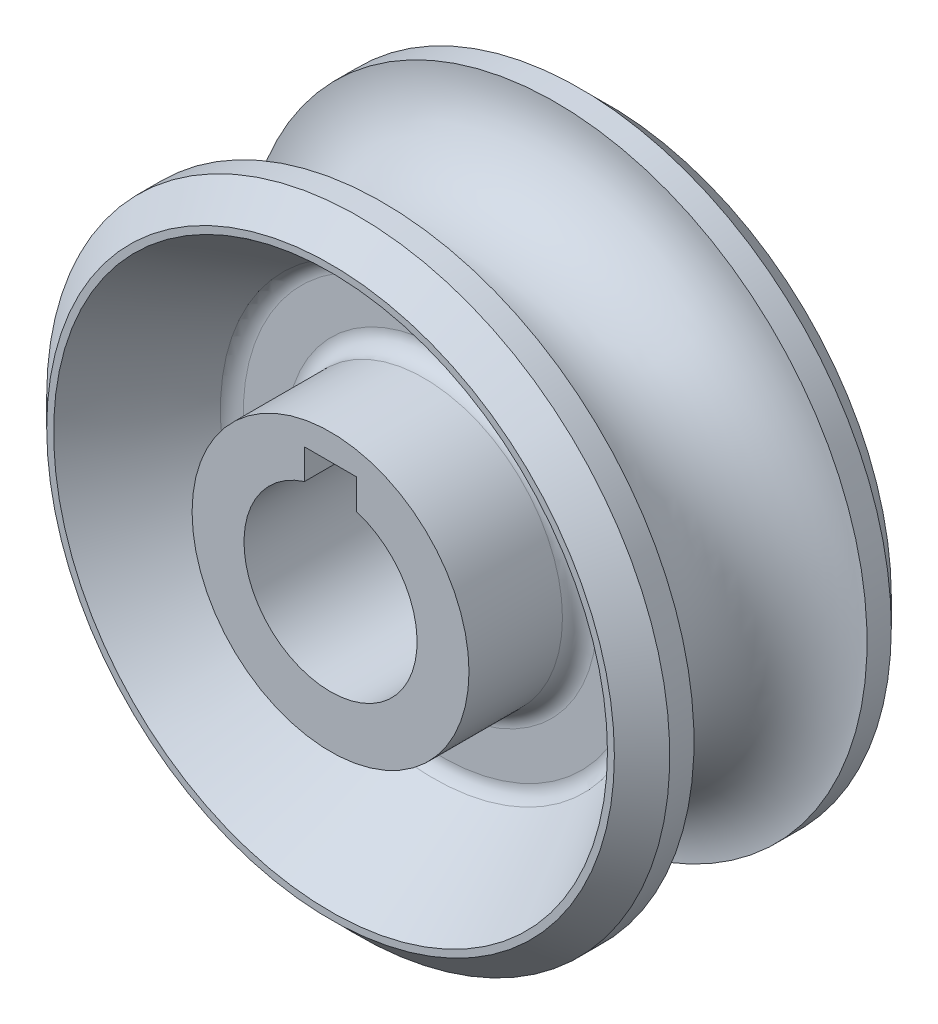
ISO-10303-21;
HEADER;
FILE_DESCRIPTION(('STEP AP214'),'2;1');
FILE_NAME('part.step','',(''),(''),'','','');
FILE_SCHEMA(('AUTOMOTIVE_DESIGN { 1 0 10303 214 1 1 1 1 }'));
ENDSEC;
DATA;
#1=APPLICATION_CONTEXT('core data for automotive mechanical design processes');
#2=APPLICATION_PROTOCOL_DEFINITION('international standard','automotive_design',2000,#1);
#3=PRODUCT_CONTEXT('',#1,'mechanical');
#4=PRODUCT('Part','Part','',(#3));
#5=PRODUCT_RELATED_PRODUCT_CATEGORY('part','',(#4));
#6=PRODUCT_DEFINITION_FORMATION('','',#4);
#7=PRODUCT_DEFINITION_CONTEXT('part definition',#1,'design');
#8=PRODUCT_DEFINITION('design','',#6,#7);
#9=PRODUCT_DEFINITION_SHAPE('','',#8);
#10=(LENGTH_UNIT() NAMED_UNIT(*) SI_UNIT(.MILLI.,.METRE.));
#11=(NAMED_UNIT(*) PLANE_ANGLE_UNIT() SI_UNIT($,.RADIAN.));
#12=(NAMED_UNIT(*) SI_UNIT($,.STERADIAN.) SOLID_ANGLE_UNIT());
#13=UNCERTAINTY_MEASURE_WITH_UNIT(LENGTH_MEASURE(1.E-05),#10,'distance_accuracy_value','');
#14=(GEOMETRIC_REPRESENTATION_CONTEXT(3) GLOBAL_UNCERTAINTY_ASSIGNED_CONTEXT((#13)) GLOBAL_UNIT_ASSIGNED_CONTEXT((#10,
#11,#12)) REPRESENTATION_CONTEXT('',''));
#15=CARTESIAN_POINT('',(0.,0.,0.));
#16=DIRECTION('',(0.,0.,1.));
#17=DIRECTION('',(1.,0.,0.));
#18=AXIS2_PLACEMENT_3D('',#15,#16,#17);
#19=CARTESIAN_POINT('',(0.,0.,12.7));
#20=DIRECTION('',(0.,0.,1.));
#21=DIRECTION('',(1.,0.,0.));
#22=AXIS2_PLACEMENT_3D('',#19,#20,#21);
#23=PLANE('',#22);
#24=DIRECTION('',(0.,-1.,0.));
#25=VECTOR('',#24,1.);
#26=CARTESIAN_POINT('',(-2.3876,10.3251,12.7));
#27=LINE('',#26,#25);
#28=CARTESIAN_POINT('',(-2.3876,10.3251,12.7));
#29=VERTEX_POINT('',#28);
#30=CARTESIAN_POINT('',(-2.3876,7.56989250187874,12.7));
#31=VERTEX_POINT('',#30);
#32=EDGE_CURVE('E82',#29,#31,#27,.T.);
#33=ORIENTED_EDGE('',*,*,#32,.F.);
#34=DIRECTION('',(-1.,0.,0.));
#35=VECTOR('',#34,1.);
#36=CARTESIAN_POINT('',(-2.3876,10.3251,12.7));
#37=LINE('',#36,#35);
#38=CARTESIAN_POINT('',(2.3876,10.3251,12.7));
#39=VERTEX_POINT('',#38);
#40=EDGE_CURVE('E81',#39,#29,#37,.T.);
#41=ORIENTED_EDGE('',*,*,#40,.F.);
#42=DIRECTION('',(0.,1.,0.));
#43=VECTOR('',#42,1.);
#44=CARTESIAN_POINT('',(2.3876,10.3251,12.7));
#45=LINE('',#44,#43);
#46=CARTESIAN_POINT('',(2.3876,7.56989250187874,12.7));
#47=VERTEX_POINT('',#46);
#48=EDGE_CURVE('E72',#47,#39,#45,.T.);
#49=ORIENTED_EDGE('',*,*,#48,.F.);
#50=CARTESIAN_POINT('',(0.,0.,12.7));
#51=DIRECTION('',(0.,0.,1.));
#52=DIRECTION('',(1.,0.,0.));
#53=AXIS2_PLACEMENT_3D('',#50,#51,#52);
#54=CIRCLE('',#53,7.9375);
#55=EDGE_CURVE('E114',#31,#47,#54,.T.);
#56=ORIENTED_EDGE('',*,*,#55,.F.);
#57=EDGE_LOOP('',(#33,#41,#49,#56));
#58=FACE_BOUND('',#57,.T.);
#59=CARTESIAN_POINT('',(0.,0.,12.7));
#60=DIRECTION('',(0.,0.,1.));
#61=DIRECTION('',(1.,0.,0.));
#62=AXIS2_PLACEMENT_3D('',#59,#60,#61);
#63=CIRCLE('',#62,12.7);
#64=CARTESIAN_POINT('',(12.7,0.,12.7));
#65=VERTEX_POINT('',#64);
#66=EDGE_CURVE('E100',#65,#65,#63,.T.);
#67=ORIENTED_EDGE('',*,*,#66,.T.);
#68=EDGE_LOOP('',(#67));
#69=FACE_BOUND('',#68,.T.);
#70=ADVANCED_FACE('F34',(#58,#69),#23,.T.);
#71=CARTESIAN_POINT('',(0.,0.,-12.7));
#72=DIRECTION('',(0.,0.,1.));
#73=DIRECTION('',(1.,0.,0.));
#74=AXIS2_PLACEMENT_3D('',#71,#72,#73);
#75=PLANE('',#74);
#76=CARTESIAN_POINT('',(0.,0.,-12.7));
#77=DIRECTION('',(0.,0.,1.));
#78=DIRECTION('',(1.,0.,0.));
#79=AXIS2_PLACEMENT_3D('',#76,#77,#78);
#80=CIRCLE('',#79,26.0349999999999);
#81=CARTESIAN_POINT('',(26.0349999999999,0.,-12.7));
#82=VERTEX_POINT('',#81);
#83=EDGE_CURVE('E127',#82,#82,#80,.F.);
#84=ORIENTED_EDGE('',*,*,#83,.T.);
#85=EDGE_LOOP('',(#84));
#86=FACE_BOUND('',#85,.T.);
#87=CARTESIAN_POINT('',(0.,0.,-12.7));
#88=DIRECTION('',(0.,0.,1.));
#89=DIRECTION('',(1.,0.,0.));
#90=AXIS2_PLACEMENT_3D('',#87,#88,#89);
#91=CIRCLE('',#90,25.4);
#92=CARTESIAN_POINT('',(25.4,0.,-12.7));
#93=VERTEX_POINT('',#92);
#94=EDGE_CURVE('E110',#93,#93,#91,.T.);
#95=ORIENTED_EDGE('',*,*,#94,.T.);
#96=EDGE_LOOP('',(#95));
#97=FACE_BOUND('',#96,.T.);
#98=ADVANCED_FACE('F185',(#86,#97),#75,.F.);
#99=DIRECTION('',(-1.,0.,0.));
#100=VECTOR('',#99,1.);
#101=CARTESIAN_POINT('',(-2.3876,10.3251,-12.7));
#102=LINE('',#101,#100);
#103=CARTESIAN_POINT('',(2.3876,10.3251,-12.7));
#104=VERTEX_POINT('',#103);
#105=CARTESIAN_POINT('',(-2.3876,10.3251,-12.7));
#106=VERTEX_POINT('',#105);
#107=EDGE_CURVE('E89',#104,#106,#102,.T.);
#108=ORIENTED_EDGE('',*,*,#107,.T.);
#109=DIRECTION('',(0.,-1.,0.));
#110=VECTOR('',#109,1.);
#111=CARTESIAN_POINT('',(-2.3876,10.3251,-12.7));
#112=LINE('',#111,#110);
#113=CARTESIAN_POINT('',(-2.3876,7.56989250187874,-12.7));
#114=VERTEX_POINT('',#113);
#115=EDGE_CURVE('E93',#106,#114,#112,.T.);
#116=ORIENTED_EDGE('',*,*,#115,.T.);
#117=CARTESIAN_POINT('',(0.,0.,-12.7));
#118=DIRECTION('',(0.,0.,1.));
#119=DIRECTION('',(1.,0.,0.));
#120=AXIS2_PLACEMENT_3D('',#117,#118,#119);
#121=CIRCLE('',#120,7.9375);
#122=CARTESIAN_POINT('',(2.3876,7.56989250187874,-12.7));
#123=VERTEX_POINT('',#122);
#124=EDGE_CURVE('E117',#114,#123,#121,.T.);
#125=ORIENTED_EDGE('',*,*,#124,.T.);
#126=DIRECTION('',(0.,1.,0.));
#127=VECTOR('',#126,1.);
#128=CARTESIAN_POINT('',(2.3876,10.3251,-12.7));
#129=LINE('',#128,#127);
#130=EDGE_CURVE('E49',#123,#104,#129,.T.);
#131=ORIENTED_EDGE('',*,*,#130,.T.);
#132=EDGE_LOOP('',(#108,#116,#125,#131));
#133=FACE_BOUND('',#132,.T.);
#134=CARTESIAN_POINT('',(0.,0.,-12.7));
#135=DIRECTION('',(0.,0.,1.));
#136=DIRECTION('',(1.,0.,0.));
#137=AXIS2_PLACEMENT_3D('',#134,#135,#136);
#138=CIRCLE('',#137,12.7);
#139=CARTESIAN_POINT('',(12.7,0.,-12.7));
#140=VERTEX_POINT('',#139);
#141=EDGE_CURVE('E107',#140,#140,#138,.T.);
#142=ORIENTED_EDGE('',*,*,#141,.F.);
#143=EDGE_LOOP('',(#142));
#144=FACE_BOUND('',#143,.T.);
#145=ADVANCED_FACE('F191',(#133,#144),#75,.F.);
#146=CARTESIAN_POINT('',(0.,0.,12.7));
#147=DIRECTION('',(0.,0.,-1.));
#148=DIRECTION('',(-1.,0.,0.));
#149=AXIS2_PLACEMENT_3D('',#146,#147,#148);
#150=CYLINDRICAL_SURFACE('',#149,28.575);
#151=CARTESIAN_POINT('',(0.,0.,10.16));
#152=DIRECTION('',(0.,0.,1.));
#153=DIRECTION('',(1.,0.,0.));
#154=AXIS2_PLACEMENT_3D('',#151,#152,#153);
#155=CIRCLE('',#154,28.575);
#156=CARTESIAN_POINT('',(-28.575,0.,10.16));
#157=VERTEX_POINT('',#156);
#158=EDGE_CURVE('E133',#157,#157,#155,.F.);
#159=CARTESIAN_POINT('',(0.,0.,7.9375));
#160=DIRECTION('',(0.,0.,-1.));
#161=DIRECTION('',(-1.,0.,0.));
#162=AXIS2_PLACEMENT_3D('',#159,#160,#161);
#163=CIRCLE('',#162,28.575);
#164=CARTESIAN_POINT('',(-28.575,0.,7.9375));
#165=VERTEX_POINT('',#164);
#166=EDGE_CURVE('E120',#165,#165,#163,.T.);
#167=CARTESIAN_POINT('',(-28.575,0.,10.16));
#168=CARTESIAN_POINT('',(-28.575,0.,10.1368489583333));
#169=CARTESIAN_POINT('',(-28.575,0.,10.1136979166667));
#170=CARTESIAN_POINT('',(-28.575,0.,10.0673958333333));
#171=CARTESIAN_POINT('',(-28.575,0.,10.0442447916667));
#172=CARTESIAN_POINT('',(-28.575,0.,9.99794270833335));
#173=CARTESIAN_POINT('',(-28.575,0.,9.97479166666668));
#174=CARTESIAN_POINT('',(-28.575,0.,9.92848958333335));
#175=CARTESIAN_POINT('',(-28.575,0.,9.90533854166668));
#176=CARTESIAN_POINT('',(-28.575,0.,9.85903645833334));
#177=CARTESIAN_POINT('',(-28.575,0.,9.83588541666668));
#178=CARTESIAN_POINT('',(-28.575,0.,9.78958333333335));
#179=CARTESIAN_POINT('',(-28.575,0.,9.76643229166668));
#180=CARTESIAN_POINT('',(-28.575,0.,9.72013020833334));
#181=CARTESIAN_POINT('',(-28.575,0.,9.69697916666668));
#182=CARTESIAN_POINT('',(-28.575,0.,9.65067708333334));
#183=CARTESIAN_POINT('',(-28.575,0.,9.62752604166668));
#184=CARTESIAN_POINT('',(-28.575,0.,9.58122395833334));
#185=CARTESIAN_POINT('',(-28.575,0.,9.55807291666668));
#186=CARTESIAN_POINT('',(-28.575,0.,9.51177083333334));
#187=CARTESIAN_POINT('',(-28.575,0.,9.48861979166668));
#188=CARTESIAN_POINT('',(-28.575,0.,9.44231770833334));
#189=CARTESIAN_POINT('',(-28.575,0.,9.41916666666667));
#190=CARTESIAN_POINT('',(-28.575,0.,9.37286458333334));
#191=CARTESIAN_POINT('',(-28.575,0.,9.34971354166667));
#192=CARTESIAN_POINT('',(-28.575,0.,9.30341145833334));
#193=CARTESIAN_POINT('',(-28.575,0.,9.28026041666667));
#194=CARTESIAN_POINT('',(-28.575,0.,9.23395833333334));
#195=CARTESIAN_POINT('',(-28.575,0.,9.21080729166667));
#196=CARTESIAN_POINT('',(-28.575,0.,9.16450520833334));
#197=CARTESIAN_POINT('',(-28.575,0.,9.14135416666667));
#198=CARTESIAN_POINT('',(-28.575,0.,9.09505208333334));
#199=CARTESIAN_POINT('',(-28.575,0.,9.07190104166667));
#200=CARTESIAN_POINT('',(-28.575,0.,9.02559895833334));
#201=CARTESIAN_POINT('',(-28.575,0.,9.00244791666667));
#202=CARTESIAN_POINT('',(-28.575,0.,8.95614583333334));
#203=CARTESIAN_POINT('',(-28.575,0.,8.93299479166667));
#204=CARTESIAN_POINT('',(-28.575,0.,8.88669270833334));
#205=CARTESIAN_POINT('',(-28.575,0.,8.86354166666667));
#206=CARTESIAN_POINT('',(-28.575,0.,8.81723958333334));
#207=CARTESIAN_POINT('',(-28.575,0.,8.79408854166667));
#208=CARTESIAN_POINT('',(-28.575,0.,8.74778645833334));
#209=CARTESIAN_POINT('',(-28.575,0.,8.72463541666667));
#210=CARTESIAN_POINT('',(-28.575,0.,8.67833333333333));
#211=CARTESIAN_POINT('',(-28.575,0.,8.65518229166667));
#212=CARTESIAN_POINT('',(-28.575,0.,8.60888020833333));
#213=CARTESIAN_POINT('',(-28.575,0.,8.58572916666667));
#214=CARTESIAN_POINT('',(-28.575,0.,8.53942708333333));
#215=CARTESIAN_POINT('',(-28.575,0.,8.51627604166667));
#216=CARTESIAN_POINT('',(-28.575,0.,8.46997395833333));
#217=CARTESIAN_POINT('',(-28.575,0.,8.44682291666667));
#218=CARTESIAN_POINT('',(-28.575,0.,8.40052083333333));
#219=CARTESIAN_POINT('',(-28.575,0.,8.37736979166667));
#220=CARTESIAN_POINT('',(-28.575,0.,8.33106770833333));
#221=CARTESIAN_POINT('',(-28.575,0.,8.30791666666667));
#222=CARTESIAN_POINT('',(-28.575,0.,8.26161458333333));
#223=CARTESIAN_POINT('',(-28.575,0.,8.23846354166667));
#224=CARTESIAN_POINT('',(-28.575,0.,8.19216145833333));
#225=CARTESIAN_POINT('',(-28.575,0.,8.16901041666667));
#226=CARTESIAN_POINT('',(-28.575,0.,8.12270833333333));
#227=CARTESIAN_POINT('',(-28.575,0.,8.09955729166666));
#228=CARTESIAN_POINT('',(-28.575,0.,8.05325520833333));
#229=CARTESIAN_POINT('',(-28.575,0.,8.03010416666666));
#230=CARTESIAN_POINT('',(-28.575,0.,7.98380208333333));
#231=CARTESIAN_POINT('',(-28.575,0.,7.96065104166666));
#232=CARTESIAN_POINT('',(-28.575,0.,7.9375));
#233=B_SPLINE_CURVE_WITH_KNOTS('',3,(#167,#168,#169,#170,#171,#172,#173,#174,#175,#176,#177,
#178,#179,#180,#181,#182,#183,#184,#185,#186,#187,#188,#189,#190,#191,#192,#193,#194,#195,#196,
#197,#198,#199,#200,#201,#202,#203,#204,#205,#206,#207,#208,#209,#210,#211,#212,#213,#214,#215,
#216,#217,#218,#219,#220,#221,#222,#223,#224,#225,#226,#227,#228,#229,#230,#231,#232),
.UNSPECIFIED.,.F.,.F.,(4,2,2,2,2,2,2,2,2,2,2,2,2,2,2,2,2,2,2,2,2,2,2,2,2,2,2,2,2,2,2,2,4),(0.,
0.0694531250000005,0.138906250000001,0.208359375000002,0.277812500000002,0.347265625000003,
0.416718750000003,0.486171875000004,0.555625000000004,0.625078125000005,0.694531250000005,
0.763984375000007,0.833437500000008,0.902890625000008,0.972343750000009,1.04179687500001,
1.11125000000001,1.18070312500001,1.25015625000001,1.31960937500001,1.38906250000001,
1.45851562500001,1.52796875000001,1.59742187500001,1.66687500000001,1.73632812500001,
1.80578125000001,1.87523437500002,1.94468750000002,2.01414062500002,2.08359375000002,
2.15304687500002,2.22250000000002),.UNSPECIFIED.);
#234=EDGE_CURVE('BSEAM205',#157,#165,#233,.T.);
#235=ORIENTED_EDGE('',*,*,#158,.T.);
#236=ORIENTED_EDGE('',*,*,#166,.F.);
#237=ORIENTED_EDGE('',*,*,#234,.T.);
#238=ORIENTED_EDGE('',*,*,#234,.F.);
#239=EDGE_LOOP('',(#235,#237,#236,#238));
#240=FACE_BOUND('',#239,.T.);
#241=ADVANCED_FACE('F205',(#240),#150,.T.);
#242=CARTESIAN_POINT('',(0.,0.,-10.1599999999999));
#243=DIRECTION('',(0.,0.,1.));
#244=DIRECTION('',(1.,0.,0.));
#245=AXIS2_PLACEMENT_3D('',#242,#243,#244);
#246=CIRCLE('',#245,28.575);
#247=CARTESIAN_POINT('',(-28.575,0.,-10.16));
#248=VERTEX_POINT('',#247);
#249=EDGE_CURVE('E116',#248,#248,#246,.T.);
#250=CARTESIAN_POINT('',(0.,0.,-7.9375));
#251=DIRECTION('',(0.,0.,1.));
#252=DIRECTION('',(1.,0.,0.));
#253=AXIS2_PLACEMENT_3D('',#250,#251,#252);
#254=CIRCLE('',#253,28.575);
#255=CARTESIAN_POINT('',(-28.575,0.,-7.93750000000001));
#256=VERTEX_POINT('',#255);
#257=EDGE_CURVE('E113',#256,#256,#254,.T.);
#258=CARTESIAN_POINT('',(-28.575,0.,-10.16));
#259=CARTESIAN_POINT('',(-28.575,0.,-10.1368489583333));
#260=CARTESIAN_POINT('',(-28.575,0.,-10.1136979166666));
#261=CARTESIAN_POINT('',(-28.575,0.,-10.0673958333333));
#262=CARTESIAN_POINT('',(-28.575,0.,-10.0442447916666));
#263=CARTESIAN_POINT('',(-28.575,0.,-9.99794270833329));
#264=CARTESIAN_POINT('',(-28.575,0.,-9.97479166666662));
#265=CARTESIAN_POINT('',(-28.575,0.,-9.92848958333329));
#266=CARTESIAN_POINT('',(-28.575,0.,-9.90533854166662));
#267=CARTESIAN_POINT('',(-28.575,0.,-9.85903645833329));
#268=CARTESIAN_POINT('',(-28.575,0.,-9.83588541666663));
#269=CARTESIAN_POINT('',(-28.575,0.,-9.78958333333329));
#270=CARTESIAN_POINT('',(-28.575,0.,-9.76643229166663));
#271=CARTESIAN_POINT('',(-28.575,0.,-9.72013020833329));
#272=CARTESIAN_POINT('',(-28.575,0.,-9.69697916666663));
#273=CARTESIAN_POINT('',(-28.575,0.,-9.6506770833333));
#274=CARTESIAN_POINT('',(-28.575,0.,-9.62752604166663));
#275=CARTESIAN_POINT('',(-28.575,0.,-9.5812239583333));
#276=CARTESIAN_POINT('',(-28.575,0.,-9.55807291666663));
#277=CARTESIAN_POINT('',(-28.575,0.,-9.5117708333333));
#278=CARTESIAN_POINT('',(-28.575,0.,-9.48861979166663));
#279=CARTESIAN_POINT('',(-28.575,0.,-9.4423177083333));
#280=CARTESIAN_POINT('',(-28.575,0.,-9.41916666666664));
#281=CARTESIAN_POINT('',(-28.575,0.,-9.37286458333331));
#282=CARTESIAN_POINT('',(-28.575,0.,-9.34971354166664));
#283=CARTESIAN_POINT('',(-28.575,0.,-9.30341145833331));
#284=CARTESIAN_POINT('',(-28.575,0.,-9.28026041666664));
#285=CARTESIAN_POINT('',(-28.575,0.,-9.23395833333331));
#286=CARTESIAN_POINT('',(-28.575,0.,-9.21080729166664));
#287=CARTESIAN_POINT('',(-28.575,0.,-9.16450520833331));
#288=CARTESIAN_POINT('',(-28.575,0.,-9.14135416666664));
#289=CARTESIAN_POINT('',(-28.575,0.,-9.09505208333331));
#290=CARTESIAN_POINT('',(-28.575,0.,-9.07190104166664));
#291=CARTESIAN_POINT('',(-28.575,0.,-9.02559895833331));
#292=CARTESIAN_POINT('',(-28.575,0.,-9.00244791666665));
#293=CARTESIAN_POINT('',(-28.575,0.,-8.95614583333331));
#294=CARTESIAN_POINT('',(-28.575,0.,-8.93299479166665));
#295=CARTESIAN_POINT('',(-28.575,0.,-8.88669270833332));
#296=CARTESIAN_POINT('',(-28.575,0.,-8.86354166666665));
#297=CARTESIAN_POINT('',(-28.575,0.,-8.81723958333332));
#298=CARTESIAN_POINT('',(-28.575,0.,-8.79408854166665));
#299=CARTESIAN_POINT('',(-28.575,0.,-8.74778645833332));
#300=CARTESIAN_POINT('',(-28.575,0.,-8.72463541666665));
#301=CARTESIAN_POINT('',(-28.575,0.,-8.67833333333332));
#302=CARTESIAN_POINT('',(-28.575,0.,-8.65518229166666));
#303=CARTESIAN_POINT('',(-28.575,0.,-8.60888020833332));
#304=CARTESIAN_POINT('',(-28.575,0.,-8.58572916666666));
#305=CARTESIAN_POINT('',(-28.575,0.,-8.53942708333332));
#306=CARTESIAN_POINT('',(-28.575,0.,-8.51627604166666));
#307=CARTESIAN_POINT('',(-28.575,0.,-8.46997395833333));
#308=CARTESIAN_POINT('',(-28.575,0.,-8.44682291666666));
#309=CARTESIAN_POINT('',(-28.575,0.,-8.40052083333333));
#310=CARTESIAN_POINT('',(-28.575,0.,-8.37736979166666));
#311=CARTESIAN_POINT('',(-28.575,0.,-8.33106770833333));
#312=CARTESIAN_POINT('',(-28.575,0.,-8.30791666666666));
#313=CARTESIAN_POINT('',(-28.575,0.,-8.26161458333333));
#314=CARTESIAN_POINT('',(-28.575,0.,-8.23846354166667));
#315=CARTESIAN_POINT('',(-28.575,0.,-8.19216145833333));
#316=CARTESIAN_POINT('',(-28.575,0.,-8.16901041666667));
#317=CARTESIAN_POINT('',(-28.575,0.,-8.12270833333333));
#318=CARTESIAN_POINT('',(-28.575,0.,-8.09955729166667));
#319=CARTESIAN_POINT('',(-28.575,0.,-8.05325520833333));
#320=CARTESIAN_POINT('',(-28.575,0.,-8.03010416666667));
#321=CARTESIAN_POINT('',(-28.575,0.,-7.98380208333334));
#322=CARTESIAN_POINT('',(-28.575,0.,-7.96065104166667));
#323=CARTESIAN_POINT('',(-28.575,0.,-7.93750000000001));
#324=B_SPLINE_CURVE_WITH_KNOTS('',3,(#258,#259,#260,#261,#262,#263,#264,#265,#266,#267,#268,
#269,#270,#271,#272,#273,#274,#275,#276,#277,#278,#279,#280,#281,#282,#283,#284,#285,#286,#287,
#288,#289,#290,#291,#292,#293,#294,#295,#296,#297,#298,#299,#300,#301,#302,#303,#304,#305,#306,
#307,#308,#309,#310,#311,#312,#313,#314,#315,#316,#317,#318,#319,#320,#321,#322,#323),
.UNSPECIFIED.,.F.,.F.,(4,2,2,2,2,2,2,2,2,2,2,2,2,2,2,2,2,2,2,2,2,2,2,2,2,2,2,2,2,2,2,2,4),(0.,
0.069453124999997,0.138906249999998,0.208359374999995,0.277812499999995,0.347265624999992,
0.416718749999989,0.48617187499999,0.555624999999987,0.625078124999984,0.694531249999984,
0.763984374999981,0.833437499999978,0.902890624999979,0.972343749999976,1.04179687499998,
1.11124999999997,1.18070312499997,1.25015624999997,1.31960937499997,1.38906249999997,
1.45851562499997,1.52796874999996,1.59742187499996,1.66687499999996,1.73632812499996,
1.80578124999996,1.87523437499995,1.94468749999995,2.01414062499995,2.08359374999995,
2.15304687499995,2.22249999999995),.UNSPECIFIED.);
#325=EDGE_CURVE('BSEAM197',#248,#256,#324,.T.);
#326=ORIENTED_EDGE('',*,*,#249,.T.);
#327=ORIENTED_EDGE('',*,*,#257,.F.);
#328=ORIENTED_EDGE('',*,*,#325,.T.);
#329=ORIENTED_EDGE('',*,*,#325,.F.);
#330=EDGE_LOOP('',(#326,#328,#327,#329));
#331=FACE_BOUND('',#330,.T.);
#332=ADVANCED_FACE('F197',(#331),#150,.T.);
#333=CARTESIAN_POINT('',(0.,0.,12.7));
#334=DIRECTION('',(0.,0.,1.));
#335=DIRECTION('',(1.,0.,0.));
#336=AXIS2_PLACEMENT_3D('',#333,#334,#335);
#337=CIRCLE('',#336,26.035);
#338=CARTESIAN_POINT('',(26.035,0.,12.7));
#339=VERTEX_POINT('',#338);
#340=EDGE_CURVE('E130',#339,#339,#337,.T.);
#341=ORIENTED_EDGE('',*,*,#340,.T.);
#342=EDGE_LOOP('',(#341));
#343=FACE_BOUND('',#342,.T.);
#344=CARTESIAN_POINT('',(0.,0.,12.7));
#345=DIRECTION('',(0.,0.,1.));
#346=DIRECTION('',(1.,0.,0.));
#347=AXIS2_PLACEMENT_3D('',#344,#345,#346);
#348=CIRCLE('',#347,25.4);
#349=CARTESIAN_POINT('',(25.4,0.,12.7));
#350=VERTEX_POINT('',#349);
#351=EDGE_CURVE('E104',#350,#350,#348,.T.);
#352=ORIENTED_EDGE('',*,*,#351,.F.);
#353=EDGE_LOOP('',(#352));
#354=FACE_BOUND('',#353,.T.);
#355=ADVANCED_FACE('F187',(#343,#354),#23,.T.);
#356=CARTESIAN_POINT('',(0.,0.,12.7));
#357=DIRECTION('',(0.,0.,-1.));
#358=DIRECTION('',(-1.,0.,0.));
#359=AXIS2_PLACEMENT_3D('',#356,#357,#358);
#360=CYLINDRICAL_SURFACE('',#359,7.9375);
#361=DIRECTION('',(0.,0.,-1.));
#362=VECTOR('',#361,1.);
#363=CARTESIAN_POINT('',(-2.3876,7.56989250187874,12.7));
#364=LINE('',#363,#362);
#365=EDGE_CURVE('E11',#31,#114,#364,.T.);
#366=ORIENTED_EDGE('',*,*,#365,.F.);
#367=ORIENTED_EDGE('',*,*,#55,.T.);
#368=DIRECTION('',(0.,0.,-1.));
#369=VECTOR('',#368,1.);
#370=CARTESIAN_POINT('',(2.3876,7.56989250187874,12.7));
#371=LINE('',#370,#369);
#372=EDGE_CURVE('E42',#123,#47,#371,.F.);
#373=ORIENTED_EDGE('',*,*,#372,.F.);
#374=ORIENTED_EDGE('',*,*,#124,.F.);
#375=EDGE_LOOP('',(#366,#367,#373,#374));
#376=FACE_BOUND('',#375,.T.);
#377=ADVANCED_FACE('F196',(#376),#360,.F.);
#378=CARTESIAN_POINT('',(0.,0.,0.));
#379=DIRECTION('',(0.,0.,1.));
#380=DIRECTION('',(1.,0.,0.));
#381=AXIS2_PLACEMENT_3D('',#378,#379,#380);
#382=TOROIDAL_SURFACE('',#381,28.575,7.9375);
#383=ORIENTED_EDGE('',*,*,#257,.T.);
#384=EDGE_LOOP('',(#383));
#385=FACE_BOUND('',#384,.T.);
#386=ORIENTED_EDGE('',*,*,#166,.T.);
#387=EDGE_LOOP('',(#386));
#388=FACE_BOUND('',#387,.T.);
#389=ADVANCED_FACE('F203',(#385,#388),#382,.F.);
#390=CARTESIAN_POINT('',(0.,0.,-12.7));
#391=DIRECTION('',(0.,0.,-1.));
#392=DIRECTION('',(-1.,0.,0.));
#393=AXIS2_PLACEMENT_3D('',#390,#391,#392);
#394=CONICAL_SURFACE('',#393,25.4,0.558599315343563);
#395=CARTESIAN_POINT('',(0.,0.,-3.28612668274496));
#396=DIRECTION('',(0.,0.,-1.));
#397=DIRECTION('',(-1.,0.,0.));
#398=AXIS2_PLACEMENT_3D('',#395,#396,#397);
#399=CIRCLE('',#398,19.5163291767156);
#400=CARTESIAN_POINT('',(-19.5163291767156,0.,-3.28612668274496));
#401=VERTEX_POINT('',#400);
#402=EDGE_CURVE('E136',#401,#401,#399,.F.);
#403=ORIENTED_EDGE('',*,*,#402,.T.);
#404=EDGE_LOOP('',(#403));
#405=FACE_BOUND('',#404,.T.);
#406=ORIENTED_EDGE('',*,*,#94,.F.);
#407=EDGE_LOOP('',(#406));
#408=FACE_BOUND('',#407,.T.);
#409=ADVANCED_FACE('F324',(#405,#408),#394,.F.);
#410=CARTESIAN_POINT('',(0.,0.,0.));
#411=DIRECTION('',(0.,0.,1.));
#412=DIRECTION('',(1.,0.,0.));
#413=AXIS2_PLACEMENT_3D('',#410,#411,#412);
#414=CYLINDRICAL_SURFACE('',#413,12.7);
#415=CARTESIAN_POINT('',(0.,0.,-4.1275));
#416=DIRECTION('',(0.,0.,-1.));
#417=DIRECTION('',(-1.,0.,0.));
#418=AXIS2_PLACEMENT_3D('',#415,#416,#417);
#419=CIRCLE('',#418,12.7);
#420=CARTESIAN_POINT('',(-12.7,0.,-4.1275));
#421=VERTEX_POINT('',#420);
#422=EDGE_CURVE('E145',#421,#421,#419,.T.);
#423=ORIENTED_EDGE('',*,*,#422,.T.);
#424=EDGE_LOOP('',(#423));
#425=FACE_BOUND('',#424,.T.);
#426=ORIENTED_EDGE('',*,*,#141,.T.);
#427=EDGE_LOOP('',(#426));
#428=FACE_BOUND('',#427,.T.);
#429=ADVANCED_FACE('F315',(#425,#428),#414,.T.);
#430=CARTESIAN_POINT('',(0.,12.7,-2.54));
#431=DIRECTION('',(0.,0.,-1.));
#432=DIRECTION('',(-1.,0.,0.));
#433=AXIS2_PLACEMENT_3D('',#430,#431,#432);
#434=PLANE('',#433);
#435=CARTESIAN_POINT('',(0.,0.,-2.54));
#436=DIRECTION('',(0.,0.,-1.));
#437=DIRECTION('',(-1.,0.,0.));
#438=AXIS2_PLACEMENT_3D('',#435,#436,#437);
#439=CIRCLE('',#438,18.1701318691075);
#440=CARTESIAN_POINT('',(-18.1701318691075,0.,-2.54));
#441=VERTEX_POINT('',#440);
#442=EDGE_CURVE('E142',#441,#441,#439,.T.);
#443=ORIENTED_EDGE('',*,*,#442,.T.);
#444=EDGE_LOOP('',(#443));
#445=FACE_BOUND('',#444,.T.);
#446=CARTESIAN_POINT('',(0.,0.,-2.54));
#447=DIRECTION('',(0.,0.,-1.));
#448=DIRECTION('',(-1.,0.,0.));
#449=AXIS2_PLACEMENT_3D('',#446,#447,#448);
#450=CIRCLE('',#449,14.2875);
#451=CARTESIAN_POINT('',(-14.2875,0.,-2.54));
#452=VERTEX_POINT('',#451);
#453=EDGE_CURVE('E139',#452,#452,#450,.F.);
#454=ORIENTED_EDGE('',*,*,#453,.T.);
#455=EDGE_LOOP('',(#454));
#456=FACE_BOUND('',#455,.T.);
#457=ADVANCED_FACE('F181',(#445,#456),#434,.T.);
#458=CARTESIAN_POINT('',(0.,0.,0.));
#459=DIRECTION('',(0.,0.,1.));
#460=DIRECTION('',(1.,0.,0.));
#461=AXIS2_PLACEMENT_3D('',#458,#459,#460);
#462=CYLINDRICAL_SURFACE('',#461,12.7);
#463=CARTESIAN_POINT('',(0.,0.,4.1275));
#464=DIRECTION('',(0.,0.,1.));
#465=DIRECTION('',(1.,0.,0.));
#466=AXIS2_PLACEMENT_3D('',#463,#464,#465);
#467=CIRCLE('',#466,12.7);
#468=CARTESIAN_POINT('',(12.7,0.,4.1275));
#469=VERTEX_POINT('',#468);
#470=EDGE_CURVE('E148',#469,#469,#467,.T.);
#471=ORIENTED_EDGE('',*,*,#470,.T.);
#472=EDGE_LOOP('',(#471));
#473=FACE_BOUND('',#472,.T.);
#474=ORIENTED_EDGE('',*,*,#66,.F.);
#475=EDGE_LOOP('',(#474));
#476=FACE_BOUND('',#475,.T.);
#477=ADVANCED_FACE('F172',(#473,#476),#462,.T.);
#478=CARTESIAN_POINT('',(0.,12.7,2.54));
#479=DIRECTION('',(0.,0.,1.));
#480=DIRECTION('',(1.,0.,0.));
#481=AXIS2_PLACEMENT_3D('',#478,#479,#480);
#482=PLANE('',#481);
#483=CARTESIAN_POINT('',(0.,0.,2.54));
#484=DIRECTION('',(0.,0.,1.));
#485=DIRECTION('',(1.,0.,0.));
#486=AXIS2_PLACEMENT_3D('',#483,#484,#485);
#487=CIRCLE('',#486,14.2875);
#488=CARTESIAN_POINT('',(14.2875,0.,2.54));
#489=VERTEX_POINT('',#488);
#490=EDGE_CURVE('E154',#489,#489,#487,.F.);
#491=ORIENTED_EDGE('',*,*,#490,.T.);
#492=EDGE_LOOP('',(#491));
#493=FACE_BOUND('',#492,.T.);
#494=CARTESIAN_POINT('',(0.,0.,2.54));
#495=DIRECTION('',(0.,0.,1.));
#496=DIRECTION('',(1.,0.,0.));
#497=AXIS2_PLACEMENT_3D('',#494,#495,#496);
#498=CIRCLE('',#497,18.1701318691075);
#499=CARTESIAN_POINT('',(18.1701318691075,0.,2.54));
#500=VERTEX_POINT('',#499);
#501=EDGE_CURVE('E151',#500,#500,#498,.T.);
#502=ORIENTED_EDGE('',*,*,#501,.T.);
#503=EDGE_LOOP('',(#502));
#504=FACE_BOUND('',#503,.T.);
#505=ADVANCED_FACE('F170',(#493,#504),#482,.T.);
#506=CARTESIAN_POINT('',(0.,0.,2.54));
#507=DIRECTION('',(0.,0.,1.));
#508=DIRECTION('',(1.,0.,0.));
#509=AXIS2_PLACEMENT_3D('',#506,#507,#508);
#510=CONICAL_SURFACE('',#509,19.05,0.558599315343563);
#511=CARTESIAN_POINT('',(0.,0.,3.28612668274496));
#512=DIRECTION('',(0.,0.,1.));
#513=DIRECTION('',(1.,0.,0.));
#514=AXIS2_PLACEMENT_3D('',#511,#512,#513);
#515=CIRCLE('',#514,19.5163291767156);
#516=CARTESIAN_POINT('',(19.5163291767156,0.,3.28612668274496));
#517=VERTEX_POINT('',#516);
#518=EDGE_CURVE('E157',#517,#517,#515,.F.);
#519=ORIENTED_EDGE('',*,*,#518,.T.);
#520=EDGE_LOOP('',(#519));
#521=FACE_BOUND('',#520,.T.);
#522=ORIENTED_EDGE('',*,*,#351,.T.);
#523=EDGE_LOOP('',(#522));
#524=FACE_BOUND('',#523,.T.);
#525=ADVANCED_FACE('F161',(#521,#524),#510,.F.);
#526=CARTESIAN_POINT('',(0.,0.,-10.1599999999999));
#527=DIRECTION('',(0.,0.,1.));
#528=DIRECTION('',(1.,0.,0.));
#529=AXIS2_PLACEMENT_3D('',#526,#527,#528);
#530=CONICAL_SURFACE('',#529,28.575,0.785398163397451);
#531=ORIENTED_EDGE('',*,*,#83,.F.);
#532=EDGE_LOOP('',(#531));
#533=FACE_BOUND('',#532,.T.);
#534=ORIENTED_EDGE('',*,*,#249,.F.);
#535=EDGE_LOOP('',(#534));
#536=FACE_BOUND('',#535,.T.);
#537=ADVANCED_FACE('F179',(#533,#536),#530,.T.);
#538=CARTESIAN_POINT('',(0.,0.,12.7));
#539=DIRECTION('',(0.,0.,-1.));
#540=DIRECTION('',(-1.,0.,0.));
#541=AXIS2_PLACEMENT_3D('',#538,#539,#540);
#542=CONICAL_SURFACE('',#541,26.035,0.785398163397445);
#543=ORIENTED_EDGE('',*,*,#158,.F.);
#544=EDGE_LOOP('',(#543));
#545=FACE_BOUND('',#544,.T.);
#546=ORIENTED_EDGE('',*,*,#340,.F.);
#547=EDGE_LOOP('',(#546));
#548=FACE_BOUND('',#547,.T.);
#549=ADVANCED_FACE('F212',(#545,#548),#542,.T.);
#550=CARTESIAN_POINT('',(0.,0.,-4.1275));
#551=DIRECTION('',(0.,0.,-1.));
#552=DIRECTION('',(-1.,0.,0.));
#553=AXIS2_PLACEMENT_3D('',#550,#551,#552);
#554=TOROIDAL_SURFACE('',#553,18.1701318691075,1.5875);
#555=ORIENTED_EDGE('',*,*,#442,.F.);
#556=EDGE_LOOP('',(#555));
#557=FACE_BOUND('',#556,.T.);
#558=ORIENTED_EDGE('',*,*,#402,.F.);
#559=EDGE_LOOP('',(#558));
#560=FACE_BOUND('',#559,.T.);
#561=ADVANCED_FACE('F214',(#557,#560),#554,.F.);
#562=CARTESIAN_POINT('',(0.,0.,-4.1275));
#563=DIRECTION('',(0.,0.,-1.));
#564=DIRECTION('',(-1.,0.,0.));
#565=AXIS2_PLACEMENT_3D('',#562,#563,#564);
#566=TOROIDAL_SURFACE('',#565,14.2875,1.5875);
#567=ORIENTED_EDGE('',*,*,#422,.F.);
#568=EDGE_LOOP('',(#567));
#569=FACE_BOUND('',#568,.T.);
#570=ORIENTED_EDGE('',*,*,#453,.F.);
#571=EDGE_LOOP('',(#570));
#572=FACE_BOUND('',#571,.T.);
#573=ADVANCED_FACE('F221',(#569,#572),#566,.F.);
#574=CARTESIAN_POINT('',(0.,0.,4.1275));
#575=DIRECTION('',(0.,0.,1.));
#576=DIRECTION('',(1.,0.,0.));
#577=AXIS2_PLACEMENT_3D('',#574,#575,#576);
#578=TOROIDAL_SURFACE('',#577,14.2875,1.5875);
#579=ORIENTED_EDGE('',*,*,#490,.F.);
#580=EDGE_LOOP('',(#579));
#581=FACE_BOUND('',#580,.T.);
#582=ORIENTED_EDGE('',*,*,#470,.F.);
#583=EDGE_LOOP('',(#582));
#584=FACE_BOUND('',#583,.T.);
#585=ADVANCED_FACE('F167',(#581,#584),#578,.F.);
#586=CARTESIAN_POINT('',(0.,0.,4.1275));
#587=DIRECTION('',(0.,0.,1.));
#588=DIRECTION('',(1.,0.,0.));
#589=AXIS2_PLACEMENT_3D('',#586,#587,#588);
#590=TOROIDAL_SURFACE('',#589,18.1701318691075,1.5875);
#591=ORIENTED_EDGE('',*,*,#518,.F.);
#592=EDGE_LOOP('',(#591));
#593=FACE_BOUND('',#592,.T.);
#594=ORIENTED_EDGE('',*,*,#501,.F.);
#595=EDGE_LOOP('',(#594));
#596=FACE_BOUND('',#595,.T.);
#597=ADVANCED_FACE('F36',(#593,#596),#590,.F.);
#598=CARTESIAN_POINT('',(-2.3876,10.3251,-12.7));
#599=DIRECTION('',(-1.,0.,0.));
#600=DIRECTION('',(0.,-1.,0.));
#601=AXIS2_PLACEMENT_3D('',#598,#599,#600);
#602=PLANE('',#601);
#603=ORIENTED_EDGE('',*,*,#365,.T.);
#604=ORIENTED_EDGE('',*,*,#115,.F.);
#605=DIRECTION('',(0.,0.,1.));
#606=VECTOR('',#605,1.);
#607=CARTESIAN_POINT('',(-2.3876,10.3251,-12.7));
#608=LINE('',#607,#606);
#609=EDGE_CURVE('E90',#106,#29,#608,.T.);
#610=ORIENTED_EDGE('',*,*,#609,.T.);
#611=ORIENTED_EDGE('',*,*,#32,.T.);
#612=EDGE_LOOP('',(#603,#604,#610,#611));
#613=FACE_BOUND('',#612,.T.);
#614=ADVANCED_FACE('F166',(#613),#602,.F.);
#615=CARTESIAN_POINT('',(-2.3876,10.3251,-12.7));
#616=DIRECTION('',(0.,1.,0.));
#617=DIRECTION('',(0.,0.,1.));
#618=AXIS2_PLACEMENT_3D('',#615,#616,#617);
#619=PLANE('',#618);
#620=ORIENTED_EDGE('',*,*,#609,.F.);
#621=ORIENTED_EDGE('',*,*,#107,.F.);
#622=DIRECTION('',(0.,0.,1.));
#623=VECTOR('',#622,1.);
#624=CARTESIAN_POINT('',(2.3876,10.3251,-12.7));
#625=LINE('',#624,#623);
#626=EDGE_CURVE('E75',#104,#39,#625,.T.);
#627=ORIENTED_EDGE('',*,*,#626,.T.);
#628=ORIENTED_EDGE('',*,*,#40,.T.);
#629=EDGE_LOOP('',(#620,#621,#627,#628));
#630=FACE_BOUND('',#629,.T.);
#631=ADVANCED_FACE('F86',(#630),#619,.F.);
#632=CARTESIAN_POINT('',(2.3876,10.3251,-12.7));
#633=DIRECTION('',(1.,0.,0.));
#634=DIRECTION('',(0.,1.,0.));
#635=AXIS2_PLACEMENT_3D('',#632,#633,#634);
#636=PLANE('',#635);
#637=ORIENTED_EDGE('',*,*,#372,.T.);
#638=ORIENTED_EDGE('',*,*,#48,.T.);
#639=ORIENTED_EDGE('',*,*,#626,.F.);
#640=ORIENTED_EDGE('',*,*,#130,.F.);
#641=EDGE_LOOP('',(#637,#638,#639,#640));
#642=FACE_BOUND('',#641,.T.);
#643=ADVANCED_FACE('F74',(#642),#636,.F.);
#644=CLOSED_SHELL('',(#70,#98,#145,#241,#332,#355,#377,#389,#409,#429,#457,#477,#505,#525,#537,
#549,#561,#573,#585,#597,#614,#631,#643));
#645=MANIFOLD_SOLID_BREP('B2',#644);
#646=ADVANCED_BREP_SHAPE_REPRESENTATION('',(#18,#645),#14);
#647=SHAPE_DEFINITION_REPRESENTATION(#9,#646);
ENDSEC;
END-ISO-10303-21;
